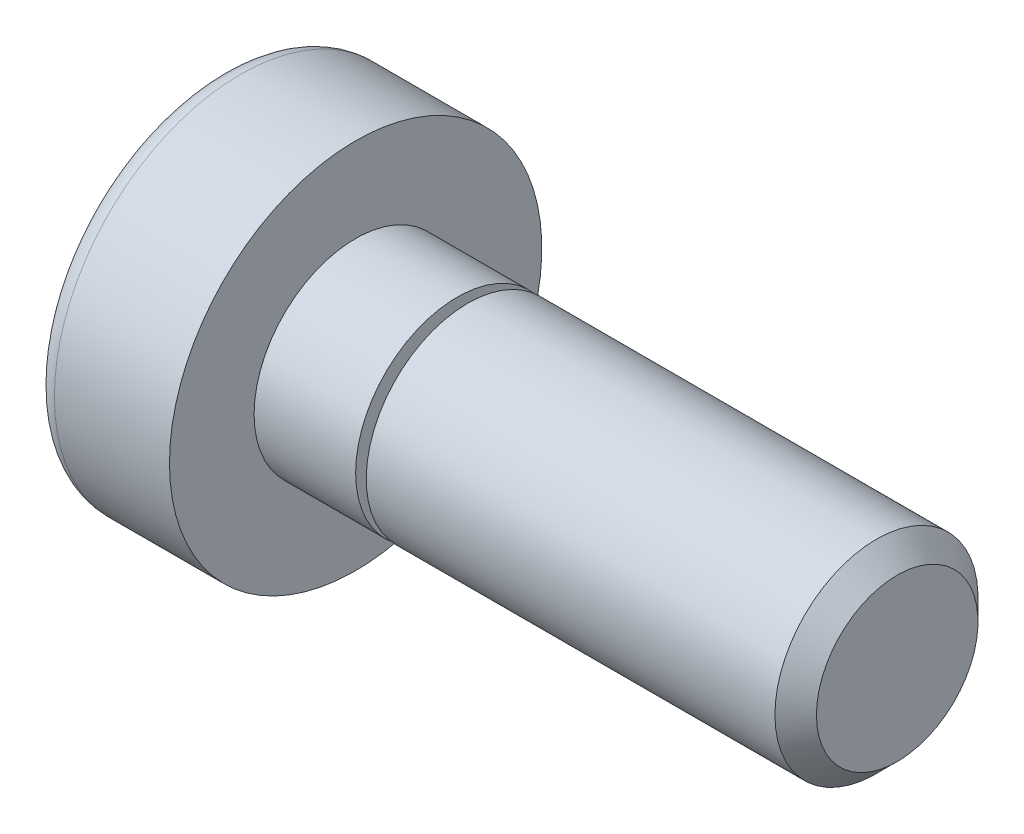
ISO-10303-21;
HEADER;
FILE_DESCRIPTION(('STEP AP214'),'2;1');
FILE_NAME('part.step','',(''),(''),'','','');
FILE_SCHEMA(('AUTOMOTIVE_DESIGN { 1 0 10303 214 1 1 1 1 }'));
ENDSEC;
DATA;
#1=APPLICATION_CONTEXT('core data for automotive mechanical design processes');
#2=APPLICATION_PROTOCOL_DEFINITION('international standard','automotive_design',2000,#1);
#3=PRODUCT_CONTEXT('',#1,'mechanical');
#4=PRODUCT('Part','Part','',(#3));
#5=PRODUCT_RELATED_PRODUCT_CATEGORY('part','',(#4));
#6=PRODUCT_DEFINITION_FORMATION('','',#4);
#7=PRODUCT_DEFINITION_CONTEXT('part definition',#1,'design');
#8=PRODUCT_DEFINITION('design','',#6,#7);
#9=PRODUCT_DEFINITION_SHAPE('','',#8);
#10=(LENGTH_UNIT() NAMED_UNIT(*) SI_UNIT(.MILLI.,.METRE.));
#11=(NAMED_UNIT(*) PLANE_ANGLE_UNIT() SI_UNIT($,.RADIAN.));
#12=(NAMED_UNIT(*) SI_UNIT($,.STERADIAN.) SOLID_ANGLE_UNIT());
#13=UNCERTAINTY_MEASURE_WITH_UNIT(LENGTH_MEASURE(1.E-05),#10,'distance_accuracy_value','');
#14=(GEOMETRIC_REPRESENTATION_CONTEXT(3) GLOBAL_UNCERTAINTY_ASSIGNED_CONTEXT((#13)) GLOBAL_UNIT_ASSIGNED_CONTEXT((#10,
#11,#12)) REPRESENTATION_CONTEXT('',''));
#15=CARTESIAN_POINT('',(0.,0.,0.));
#16=DIRECTION('',(0.,0.,1.));
#17=DIRECTION('',(1.,0.,0.));
#18=AXIS2_PLACEMENT_3D('',#15,#16,#17);
#19=CARTESIAN_POINT('',(8.00000000000001,0.596637499999982,0.));
#20=DIRECTION('',(1.,0.,0.));
#21=DIRECTION('',(0.,0.,-1.));
#22=AXIS2_PLACEMENT_3D('',#19,#20,#21);
#23=PLANE('',#22);
#24=CARTESIAN_POINT('',(8.00000000015189,0.,0.));
#25=DIRECTION('',(-1.,0.,0.));
#26=DIRECTION('',(0.,0.,1.));
#27=AXIS2_PLACEMENT_3D('',#24,#25,#26);
#28=CIRCLE('',#27,1.193275000162);
#29=CARTESIAN_POINT('',(8.00000000015189,0.,1.193275000162));
#30=VERTEX_POINT('',#29);
#31=EDGE_CURVE('E21',#30,#30,#28,.T.);
#32=ORIENTED_EDGE('',*,*,#31,.F.);
#33=EDGE_LOOP('',(#32));
#34=FACE_BOUND('',#33,.T.);
#35=ADVANCED_FACE('F17',(#34),#23,.T.);
#36=CARTESIAN_POINT('',(-0.504001038052593,0.,0.));
#37=DIRECTION('',(-1.,0.,0.));
#38=DIRECTION('',(0.,0.,1.));
#39=AXIS2_PLACEMENT_3D('',#36,#37,#38);
#40=CONICAL_SURFACE('',#39,1.16192999956868,1.04719754997475);
#41=CARTESIAN_POINT('',(-0.50000000075029,1.00000000017093,0.577948959467397));
#42=CARTESIAN_POINT('',(-0.48629237382386,1.00000000006138,0.530505986138768));
#43=CARTESIAN_POINT('',(-0.473741747990582,1.00000000001644,0.482687327239862));
#44=CARTESIAN_POINT('',(-0.451558908349822,0.999999999983497,0.386271956554048));
#45=CARTESIAN_POINT('',(-0.44193324759536,0.999999999995618,0.337673750815842));
#46=CARTESIAN_POINT('',(-0.426453805314798,1.00000000000426,0.241023607051425));
#47=CARTESIAN_POINT('',(-0.420517364499986,1.00000000000113,0.192985324559301));
#48=CARTESIAN_POINT('',(-0.412547942401927,0.999999999998846,0.0966311212845586));
#49=CARTESIAN_POINT('',(-0.41051070894798,0.999999999999682,0.0483155606396564));
#50=CARTESIAN_POINT('',(-0.410510708947904,1.00000000000029,-0.0483155606516336));
#51=CARTESIAN_POINT('',(-0.412547942401888,1.00000000000007,-0.0966311212980216));
#52=CARTESIAN_POINT('',(-0.42051736450243,0.999999999999905,-0.192985324574892));
#53=CARTESIAN_POINT('',(-0.42645380531968,0.999999999999964,-0.241023607067658));
#54=CARTESIAN_POINT('',(-0.441933247596229,1.00000000000001,-0.337673750835855));
#55=CARTESIAN_POINT('',(-0.451558908344039,1.,-0.386271956577252));
#56=CARTESIAN_POINT('',(-0.473741748006515,0.999999999999976,-0.482687327260879));
#57=CARTESIAN_POINT('',(-0.486292373868118,0.999999999999964,-0.530505986154419));
#58=CARTESIAN_POINT('',(-0.500000000862228,0.999999999999988,-0.577948959467407));
#59=B_SPLINE_CURVE_WITH_KNOTS('',3,(#41,#42,#43,#44,#45,#46,#47,#48,#49,#50,#51,#52,#53,#54,#55,
#56,#57,#58),.UNSPECIFIED.,.F.,.F.,(4,2,2,2,2,2,2,2,4),(0.,0.148196356176735,0.296722322329047,
0.44178762553006,0.586694641515675,0.731601657505277,0.876666960709908,1.02519292686637,
1.17338928304892),.UNSPECIFIED.);
#60=CARTESIAN_POINT('',(-0.500000000889303,0.9999999998933,0.577948959745722));
#61=VERTEX_POINT('',#60);
#62=CARTESIAN_POINT('',(-0.500000000853678,0.999999999893292,-0.577948959622423));
#63=VERTEX_POINT('',#62);
#64=EDGE_CURVE('E89',#61,#63,#59,.T.);
#65=ORIENTED_EDGE('',*,*,#64,.T.);
#66=CARTESIAN_POINT('',(-0.500000000750464,0.999999999897836,-0.577948959940425));
#67=CARTESIAN_POINT('',(-0.485349172417987,0.956037643373577,-0.603317483381026));
#68=CARTESIAN_POINT('',(-0.472026094856608,0.911695794901883,-0.628904993119268));
#69=CARTESIAN_POINT('',(-0.448773550966531,0.822244705373564,-0.680522837350934));
#70=CARTESIAN_POINT('',(-0.438852305303098,0.777133878102894,-0.706554087170983));
#71=CARTESIAN_POINT('',(-0.423412574947941,0.687471128207105,-0.758294070285883));
#72=CARTESIAN_POINT('',(-0.417791260614098,0.642932979666769,-0.783994855231221));
#73=CARTESIAN_POINT('',(-0.411087723114958,0.55364773953878,-0.835516995929307));
#74=CARTESIAN_POINT('',(-0.409999941275023,0.508900971214076,-0.86133816514283));
#75=CARTESIAN_POINT('',(-0.41229591450611,0.425330610917059,-0.909562528492407));
#76=CARTESIAN_POINT('',(-0.415115940411406,0.386494336443703,-0.931973041079041));
#77=CARTESIAN_POINT('',(-0.424043518593614,0.309074734851168,-0.976648102718697));
#78=CARTESIAN_POINT('',(-0.430154103428242,0.270491674344854,-0.998912497922489));
#79=CARTESIAN_POINT('',(-0.445426060622693,0.19291320262915,-1.04367923573219));
#80=CARTESIAN_POINT('',(-0.454651995831515,0.153927580990878,-1.06617592925591));
#81=CARTESIAN_POINT('',(-0.475589692626233,0.0765368941895256,-1.11083430558536));
#82=CARTESIAN_POINT('',(-0.487296553168151,0.0381308420256304,-1.13299655794095));
#83=CARTESIAN_POINT('',(-0.500000000861591,1.89814787464045E-10,-1.15499999989045));
#84=B_SPLINE_CURVE_WITH_KNOTS('',3,(#66,#67,#68,#69,#70,#71,#72,#73,#74,#75,#76,#77,#78,#79,#80,
#81,#82,#83),.UNSPECIFIED.,.F.,.F.,(4,2,2,2,2,2,2,2,4),(0.,0.158549163495099,0.317478810929082,
0.472477440453193,0.627285966368247,0.761939339569063,0.896717021353835,1.0344793450277,
1.17197201605907),.UNSPECIFIED.);
#85=CARTESIAN_POINT('',(-0.500000000853747,0.,-1.15499999987687));
#86=VERTEX_POINT('',#85);
#87=EDGE_CURVE('E117',#63,#86,#84,.T.);
#88=ORIENTED_EDGE('',*,*,#87,.T.);
#89=CARTESIAN_POINT('',(-0.500000000750449,-2.73026198863905E-10,-1.15500000003979));
#90=CARTESIAN_POINT('',(-0.485349172417975,-0.043962356687794,-1.12963147640945));
#91=CARTESIAN_POINT('',(-0.472026094856597,-0.0883042051145717,-1.10404396659337));
#92=CARTESIAN_POINT('',(-0.448773550966522,-0.177755294609957,-1.05242612230464));
#93=CARTESIAN_POINT('',(-0.43885230530309,-0.222866121892747,-1.02639487250559));
#94=CARTESIAN_POINT('',(-0.423412574947934,-0.312528871797154,-0.974654889405634));
#95=CARTESIAN_POINT('',(-0.41779126061409,-0.357067020334369,-0.948954104454888));
#96=CARTESIAN_POINT('',(-0.411087723114951,-0.446352260460088,-0.897431963752873));
#97=CARTESIAN_POINT('',(-0.409999941275016,-0.49109902878564,-0.871610794540822));
#98=CARTESIAN_POINT('',(-0.412295914506104,-0.574669389083187,-0.823386431192165));
#99=CARTESIAN_POINT('',(-0.4151159404114,-0.613505663556364,-0.800975918605219));
#100=CARTESIAN_POINT('',(-0.424043518593608,-0.690925265148767,-0.756300856965331));
#101=CARTESIAN_POINT('',(-0.430154103428237,-0.729508325655129,-0.73403646176162));
#102=CARTESIAN_POINT('',(-0.445426060622688,-0.807086797370873,-0.689269723951982));
#103=CARTESIAN_POINT('',(-0.454651995831512,-0.846072419009135,-0.666773030428251));
#104=CARTESIAN_POINT('',(-0.47558969262623,-0.923463105810469,-0.622114654098761));
#105=CARTESIAN_POINT('',(-0.487296553168149,-0.961869157974355,-0.599952401743155));
#106=CARTESIAN_POINT('',(-0.500000000861589,-0.999999999810191,-0.57794895979369));
#107=B_SPLINE_CURVE_WITH_KNOTS('',3,(#89,#90,#91,#92,#93,#94,#95,#96,#97,#98,#99,#100,#101,#102,
#103,#104,#105,#106),.UNSPECIFIED.,.F.,.F.,(4,2,2,2,2,2,2,2,4),(0.,0.158549163495095,
0.317478810929075,0.472477440453182,0.627285966368233,0.761939339569052,0.896717021353825,
1.03447934502769,1.17197201605906),.UNSPECIFIED.);
#108=CARTESIAN_POINT('',(-0.50000000085366,-0.99999999989333,-0.577948959622392));
#109=VERTEX_POINT('',#108);
#110=EDGE_CURVE('E147',#86,#109,#107,.T.);
#111=ORIENTED_EDGE('',*,*,#110,.T.);
#112=CARTESIAN_POINT('',(-0.500000000750238,-1.00000000017095,-0.577948959467375));
#113=CARTESIAN_POINT('',(-0.486292373823819,-1.00000000006139,-0.530505986138745));
#114=CARTESIAN_POINT('',(-0.473741747990546,-1.00000000001644,-0.48268732723984));
#115=CARTESIAN_POINT('',(-0.45155890834979,-0.999999999983495,-0.386271956554031));
#116=CARTESIAN_POINT('',(-0.441933247595326,-0.999999999995617,-0.337673750815828));
#117=CARTESIAN_POINT('',(-0.426453805314764,-1.00000000000426,-0.241023607051415));
#118=CARTESIAN_POINT('',(-0.420517364499953,-1.00000000000113,-0.192985324559293));
#119=CARTESIAN_POINT('',(-0.412547942401894,-0.999999999998846,-0.0966311212845551));
#120=CARTESIAN_POINT('',(-0.410510708947947,-0.999999999999682,-0.0483155606396551));
#121=CARTESIAN_POINT('',(-0.410510708947871,-1.00000000000029,0.0483155606516283));
#122=CARTESIAN_POINT('',(-0.412547942401855,-1.00000000000007,0.0966311212980118));
#123=CARTESIAN_POINT('',(-0.420517364502396,-0.999999999999905,0.192985324574873));
#124=CARTESIAN_POINT('',(-0.426453805319645,-0.999999999999964,0.241023607067635));
#125=CARTESIAN_POINT('',(-0.441933247596193,-1.00000000000001,0.337673750835823));
#126=CARTESIAN_POINT('',(-0.451558908344001,-1.,0.386271956577215));
#127=CARTESIAN_POINT('',(-0.473741748006474,-0.999999999999976,0.482687327260833));
#128=CARTESIAN_POINT('',(-0.486292373868075,-0.999999999999964,0.530505986154369));
#129=CARTESIAN_POINT('',(-0.500000000862184,-0.999999999999988,0.577948959467352));
#130=B_SPLINE_CURVE_WITH_KNOTS('',3,(#112,#113,#114,#115,#116,#117,#118,#119,#120,#121,#122,
#123,#124,#125,#126,#127,#128,#129),.UNSPECIFIED.,.F.,.F.,(4,2,2,2,2,2,2,2,4),(0.,
0.148196356176728,0.296722322329032,0.441787625530039,0.586694641515648,0.731601657505236,
0.876666960709854,1.0251929268663,1.17338928304884),.UNSPECIFIED.);
#131=CARTESIAN_POINT('',(-0.500000000853652,-0.999999999893325,0.577948959622376));
#132=VERTEX_POINT('',#131);
#133=EDGE_CURVE('E142',#109,#132,#130,.T.);
#134=ORIENTED_EDGE('',*,*,#133,.T.);
#135=CARTESIAN_POINT('',(-0.500000000750473,-0.999999999897884,0.577948959940368));
#136=CARTESIAN_POINT('',(-0.485349172417985,-0.956037643373636,0.603317483380982));
#137=CARTESIAN_POINT('',(-0.4720260948566,-0.911695794901945,0.628904993119229));
#138=CARTESIAN_POINT('',(-0.448773550966519,-0.822244705373628,0.6805228373509));
#139=CARTESIAN_POINT('',(-0.438852305303086,-0.777133878102956,0.706554087170948));
#140=CARTESIAN_POINT('',(-0.423412574947928,-0.687471128207166,0.758294070285848));
#141=CARTESIAN_POINT('',(-0.417791260614084,-0.642932979666829,0.783994855231186));
#142=CARTESIAN_POINT('',(-0.411087723114942,-0.55364773953884,0.835516995929273));
#143=CARTESIAN_POINT('',(-0.409999941275006,-0.508900971214135,0.861338165142796));
#144=CARTESIAN_POINT('',(-0.412295914506093,-0.425330610917115,0.909562528492374));
#145=CARTESIAN_POINT('',(-0.415115940411389,-0.386494336443757,0.931973041079009));
#146=CARTESIAN_POINT('',(-0.424043518593597,-0.309074734851218,0.976648102718668));
#147=CARTESIAN_POINT('',(-0.430154103428226,-0.270491674344901,0.998912497922462));
#148=CARTESIAN_POINT('',(-0.445426060622677,-0.192913202629193,1.04367923573217));
#149=CARTESIAN_POINT('',(-0.454651995831501,-0.153927580990918,1.06617592925588));
#150=CARTESIAN_POINT('',(-0.475589692626221,-0.0765368941895602,1.11083430558534));
#151=CARTESIAN_POINT('',(-0.48729655316814,-0.0381308420256624,1.13299655794093));
#152=CARTESIAN_POINT('',(-0.500000000861581,-1.89844400923488E-10,1.15499999989043));
#153=B_SPLINE_CURVE_WITH_KNOTS('',3,(#135,#136,#137,#138,#139,#140,#141,#142,#143,#144,#145,
#146,#147,#148,#149,#150,#151,#152),.UNSPECIFIED.,.F.,.F.,(4,2,2,2,2,2,2,2,4),(0.,
0.158549163495102,0.317478810929088,0.4724774404532,0.627285966368255,0.76193933956908,
0.896717021353859,1.03447934502773,1.17197201605911),.UNSPECIFIED.);
#154=CARTESIAN_POINT('',(-0.500000000853747,0.,1.15499999987686));
#155=VERTEX_POINT('',#154);
#156=EDGE_CURVE('E92',#132,#155,#153,.T.);
#157=ORIENTED_EDGE('',*,*,#156,.T.);
#158=CARTESIAN_POINT('',(-0.500000000750466,2.72993235255291E-10,1.1550000000398));
#159=CARTESIAN_POINT('',(-0.485349172417988,0.0439623566877654,1.12963147640946));
#160=CARTESIAN_POINT('',(-0.472026094856608,0.0883042051145458,1.10404396659338));
#161=CARTESIAN_POINT('',(-0.448773550966532,0.177755294609934,1.05242612230465));
#162=CARTESIAN_POINT('',(-0.438852305303101,0.222866121892726,1.02639487250561));
#163=CARTESIAN_POINT('',(-0.423412574947947,0.312528871797135,0.974654889405645));
#164=CARTESIAN_POINT('',(-0.417791260614104,0.357067020334351,0.948954104454898));
#165=CARTESIAN_POINT('',(-0.411087723114966,0.446352260460072,0.897431963752882));
#166=CARTESIAN_POINT('',(-0.409999941275032,0.491099028785625,0.87161079454083));
#167=CARTESIAN_POINT('',(-0.412295914506122,0.574669389083171,0.823386431192175));
#168=CARTESIAN_POINT('',(-0.415115940411418,0.613505663556343,0.800975918605231));
#169=CARTESIAN_POINT('',(-0.424043518593627,0.690925265148738,0.756300856965347));
#170=CARTESIAN_POINT('',(-0.430154103428255,0.729508325655096,0.734036461761639));
#171=CARTESIAN_POINT('',(-0.445426060622704,0.807086797370832,0.689269723952005));
#172=CARTESIAN_POINT('',(-0.454651995831527,0.846072419009092,0.666773030428277));
#173=CARTESIAN_POINT('',(-0.475589692626243,0.923463105810418,0.622114654098791));
#174=CARTESIAN_POINT('',(-0.48729655316816,0.961869157974301,0.599952401743187));
#175=CARTESIAN_POINT('',(-0.500000000861598,0.999999999810133,0.577948959793723));
#176=B_SPLINE_CURVE_WITH_KNOTS('',3,(#158,#159,#160,#161,#162,#163,#164,#165,#166,#167,#168,
#169,#170,#171,#172,#173,#174,#175),.UNSPECIFIED.,.F.,.F.,(4,2,2,2,2,2,2,2,4),(0.,
0.1585491634951,0.317478810929084,0.472477440453195,0.627285966368249,0.761939339569055,
0.896717021353815,1.03447934502767,1.17197201605903),.UNSPECIFIED.);
#177=EDGE_CURVE('E62',#155,#61,#176,.T.);
#178=ORIENTED_EDGE('',*,*,#177,.T.);
#179=EDGE_LOOP('',(#65,#88,#111,#134,#157,#178));
#180=FACE_BOUND('',#179,.T.);
#181=CARTESIAN_POINT('',(0.166839561870802,-1.13686837721616E-10,0.));
#182=VERTEX_POINT('',#181);
#183=VERTEX_LOOP('',#182);
#184=FACE_BOUND('',#183,.T.);
#185=ADVANCED_FACE('F86',(#180,#184),#40,.F.);
#186=CARTESIAN_POINT('',(7.69327499995143,0.,0.));
#187=DIRECTION('',(-1.,0.,0.));
#188=DIRECTION('',(0.,0.,1.));
#189=AXIS2_PLACEMENT_3D('',#186,#187,#188);
#190=CONICAL_SURFACE('',#189,1.49999999979403,0.78539816247083);
#191=CARTESIAN_POINT('',(7.6932750000001,0.,0.));
#192=DIRECTION('',(-1.,0.,0.));
#193=DIRECTION('',(0.,1.,0.));
#194=AXIS2_PLACEMENT_3D('',#191,#192,#193);
#195=CIRCLE('',#194,1.49999999999999);
#196=CARTESIAN_POINT('',(7.6932750000001,1.49999999999997,0.));
#197=VERTEX_POINT('',#196);
#198=EDGE_CURVE('E104',#197,#197,#195,.T.);
#199=ORIENTED_EDGE('',*,*,#198,.F.);
#200=EDGE_LOOP('',(#199));
#201=FACE_BOUND('',#200,.T.);
#202=ORIENTED_EDGE('',*,*,#31,.T.);
#203=EDGE_LOOP('',(#202));
#204=FACE_BOUND('',#203,.T.);
#205=ADVANCED_FACE('F129',(#201,#204),#190,.T.);
#206=CARTESIAN_POINT('',(-2.,0.,1.155));
#207=DIRECTION('',(0.,0.499805607369879,0.86613760733594));
#208=DIRECTION('',(0.,-0.86613760733594,0.499805607369879));
#209=AXIS2_PLACEMENT_3D('',#206,#207,#208);
#210=PLANE('',#209);
#211=DIRECTION('',(1.,0.,0.));
#212=VECTOR('',#211,1.);
#213=CARTESIAN_POINT('',(-2.,0.,1.15500000000001));
#214=LINE('',#213,#212);
#215=CARTESIAN_POINT('',(-2.,0.,1.155));
#216=VERTEX_POINT('',#215);
#217=EDGE_CURVE('E94',#155,#216,#214,.F.);
#218=ORIENTED_EDGE('',*,*,#217,.T.);
#219=DIRECTION('',(0.,-0.866137607335932,0.499805607369892));
#220=VECTOR('',#219,1.);
#221=CARTESIAN_POINT('',(-2.,0.999999999999988,0.577948959684148));
#222=LINE('',#221,#220);
#223=CARTESIAN_POINT('',(-2.,0.999999999999988,0.577948959684148));
#224=VERTEX_POINT('',#223);
#225=EDGE_CURVE('E83',#224,#216,#222,.T.);
#226=ORIENTED_EDGE('',*,*,#225,.F.);
#227=DIRECTION('',(1.,0.,0.));
#228=VECTOR('',#227,1.);
#229=CARTESIAN_POINT('',(-2.,0.999999999999988,0.577948959684148));
#230=LINE('',#229,#228);
#231=EDGE_CURVE('E95',#224,#61,#230,.T.);
#232=ORIENTED_EDGE('',*,*,#231,.T.);
#233=ORIENTED_EDGE('',*,*,#177,.F.);
#234=EDGE_LOOP('',(#218,#226,#232,#233));
#235=FACE_BOUND('',#234,.T.);
#236=ADVANCED_FACE('F96',(#235),#210,.F.);
#237=CARTESIAN_POINT('',(-2.,-0.999999999999988,0.577948959684148));
#238=DIRECTION('',(0.,-0.499805607369879,0.86613760733594));
#239=DIRECTION('',(0.,-0.86613760733594,-0.499805607369879));
#240=AXIS2_PLACEMENT_3D('',#237,#238,#239);
#241=PLANE('',#240);
#242=DIRECTION('',(1.,0.,0.));
#243=VECTOR('',#242,1.);
#244=CARTESIAN_POINT('',(-2.,-0.999999999999988,0.577948959684097));
#245=LINE('',#244,#243);
#246=CARTESIAN_POINT('',(-2.,-0.999999999999988,0.577948959684116));
#247=VERTEX_POINT('',#246);
#248=EDGE_CURVE('E265',#132,#247,#245,.F.);
#249=ORIENTED_EDGE('',*,*,#248,.T.);
#250=DIRECTION('',(0.,-0.866137607335932,-0.499805607369892));
#251=VECTOR('',#250,1.);
#252=CARTESIAN_POINT('',(-2.,0.,1.155));
#253=LINE('',#252,#251);
#254=EDGE_CURVE('E228',#216,#247,#253,.T.);
#255=ORIENTED_EDGE('',*,*,#254,.F.);
#256=ORIENTED_EDGE('',*,*,#217,.F.);
#257=ORIENTED_EDGE('',*,*,#156,.F.);
#258=EDGE_LOOP('',(#249,#255,#256,#257));
#259=FACE_BOUND('',#258,.T.);
#260=ADVANCED_FACE('F263',(#259),#241,.F.);
#261=CARTESIAN_POINT('',(-2.,-0.999999999999988,-0.577948959684148));
#262=DIRECTION('',(0.,-1.,0.));
#263=DIRECTION('',(0.,0.,-1.));
#264=AXIS2_PLACEMENT_3D('',#261,#262,#263);
#265=PLANE('',#264);
#266=DIRECTION('',(1.,0.,0.));
#267=VECTOR('',#266,1.);
#268=CARTESIAN_POINT('',(-2.,-1.00000000000008,-0.577948959684112));
#269=LINE('',#268,#267);
#270=CARTESIAN_POINT('',(-2.,-1.00000000000005,-0.577948959684124));
#271=VERTEX_POINT('',#270);
#272=EDGE_CURVE('E154',#109,#271,#269,.F.);
#273=ORIENTED_EDGE('',*,*,#272,.T.);
#274=DIRECTION('',(0.,0.,1.));
#275=VECTOR('',#274,1.);
#276=CARTESIAN_POINT('',(-2.,-0.999999999999988,0.));
#277=LINE('',#276,#275);
#278=EDGE_CURVE('E242',#247,#271,#277,.F.);
#279=ORIENTED_EDGE('',*,*,#278,.F.);
#280=ORIENTED_EDGE('',*,*,#248,.F.);
#281=ORIENTED_EDGE('',*,*,#133,.F.);
#282=EDGE_LOOP('',(#273,#279,#280,#281));
#283=FACE_BOUND('',#282,.T.);
#284=ADVANCED_FACE('F159',(#283),#265,.F.);
#285=CARTESIAN_POINT('',(-2.,0.,-1.155));
#286=DIRECTION('',(0.,-0.499805607369879,-0.86613760733594));
#287=DIRECTION('',(0.,0.86613760733594,-0.499805607369879));
#288=AXIS2_PLACEMENT_3D('',#285,#286,#287);
#289=PLANE('',#288);
#290=DIRECTION('',(1.,0.,0.));
#291=VECTOR('',#290,1.);
#292=CARTESIAN_POINT('',(-2.,0.,-1.15500000000002));
#293=LINE('',#292,#291);
#294=CARTESIAN_POINT('',(-2.,0.,-1.15500000000001));
#295=VERTEX_POINT('',#294);
#296=EDGE_CURVE('E153',#86,#295,#293,.F.);
#297=ORIENTED_EDGE('',*,*,#296,.T.);
#298=DIRECTION('',(0.,0.866137607335932,-0.499805607369892));
#299=VECTOR('',#298,1.);
#300=CARTESIAN_POINT('',(-2.,-0.999999999999988,-0.577948959684148));
#301=LINE('',#300,#299);
#302=EDGE_CURVE('E237',#271,#295,#301,.T.);
#303=ORIENTED_EDGE('',*,*,#302,.F.);
#304=ORIENTED_EDGE('',*,*,#272,.F.);
#305=ORIENTED_EDGE('',*,*,#110,.F.);
#306=EDGE_LOOP('',(#297,#303,#304,#305));
#307=FACE_BOUND('',#306,.T.);
#308=ADVANCED_FACE('F155',(#307),#289,.F.);
#309=CARTESIAN_POINT('',(-2.,0.999999999999988,-0.577948959684148));
#310=DIRECTION('',(0.,0.499805607369879,-0.86613760733594));
#311=DIRECTION('',(0.,0.86613760733594,0.499805607369879));
#312=AXIS2_PLACEMENT_3D('',#309,#310,#311);
#313=PLANE('',#312);
#314=DIRECTION('',(1.,0.,0.));
#315=VECTOR('',#314,1.);
#316=CARTESIAN_POINT('',(-2.,0.999999999999988,-0.577948959684173));
#317=LINE('',#316,#315);
#318=CARTESIAN_POINT('',(-2.,0.999999999999988,-0.577948959684164));
#319=VERTEX_POINT('',#318);
#320=EDGE_CURVE('E100',#63,#319,#317,.F.);
#321=ORIENTED_EDGE('',*,*,#320,.T.);
#322=DIRECTION('',(0.,0.866137607335932,0.499805607369892));
#323=VECTOR('',#322,1.);
#324=CARTESIAN_POINT('',(-2.,0.,-1.155));
#325=LINE('',#324,#323);
#326=EDGE_CURVE('E232',#295,#319,#325,.T.);
#327=ORIENTED_EDGE('',*,*,#326,.F.);
#328=ORIENTED_EDGE('',*,*,#296,.F.);
#329=ORIENTED_EDGE('',*,*,#87,.F.);
#330=EDGE_LOOP('',(#321,#327,#328,#329));
#331=FACE_BOUND('',#330,.T.);
#332=ADVANCED_FACE('F158',(#331),#313,.F.);
#333=CARTESIAN_POINT('',(-2.,0.999999999999988,0.577948959684148));
#334=DIRECTION('',(0.,1.,0.));
#335=DIRECTION('',(0.,0.,1.));
#336=AXIS2_PLACEMENT_3D('',#333,#334,#335);
#337=PLANE('',#336);
#338=ORIENTED_EDGE('',*,*,#231,.F.);
#339=DIRECTION('',(0.,0.,1.));
#340=VECTOR('',#339,1.);
#341=CARTESIAN_POINT('',(-2.,0.999999999999988,0.));
#342=LINE('',#341,#340);
#343=EDGE_CURVE('E225',#319,#224,#342,.T.);
#344=ORIENTED_EDGE('',*,*,#343,.F.);
#345=ORIENTED_EDGE('',*,*,#320,.F.);
#346=ORIENTED_EDGE('',*,*,#64,.F.);
#347=EDGE_LOOP('',(#338,#344,#345,#346));
#348=FACE_BOUND('',#347,.T.);
#349=ADVANCED_FACE('F103',(#348),#337,.F.);
#350=CARTESIAN_POINT('',(7.6932750000001,0.,0.));
#351=DIRECTION('',(-1.,0.,0.));
#352=DIRECTION('',(0.,0.,1.));
#353=AXIS2_PLACEMENT_3D('',#350,#351,#352);
#354=CYLINDRICAL_SURFACE('',#353,1.49999999999999);
#355=CARTESIAN_POINT('',(1.65630773523162,0.,0.));
#356=DIRECTION('',(1.,0.,0.));
#357=DIRECTION('',(0.,1.,0.));
#358=AXIS2_PLACEMENT_3D('',#355,#356,#357);
#359=CIRCLE('',#358,1.49999999990769);
#360=CARTESIAN_POINT('',(1.65630773523162,1.49999999990769,0.));
#361=VERTEX_POINT('',#360);
#362=EDGE_CURVE('E214',#361,#361,#359,.F.);
#363=ORIENTED_EDGE('',*,*,#362,.F.);
#364=EDGE_LOOP('',(#363));
#365=FACE_BOUND('',#364,.T.);
#366=ORIENTED_EDGE('',*,*,#198,.T.);
#367=EDGE_LOOP('',(#366));
#368=FACE_BOUND('',#367,.T.);
#369=ADVANCED_FACE('F169',(#365,#368),#354,.T.);
#370=CARTESIAN_POINT('',(-2.,1.95250000000001,0.));
#371=DIRECTION('',(-1.,0.,0.));
#372=DIRECTION('',(0.,0.,1.));
#373=AXIS2_PLACEMENT_3D('',#370,#371,#372);
#374=PLANE('',#373);
#375=ORIENTED_EDGE('',*,*,#326,.T.);
#376=ORIENTED_EDGE('',*,*,#343,.T.);
#377=ORIENTED_EDGE('',*,*,#225,.T.);
#378=ORIENTED_EDGE('',*,*,#254,.T.);
#379=ORIENTED_EDGE('',*,*,#278,.T.);
#380=ORIENTED_EDGE('',*,*,#302,.T.);
#381=EDGE_LOOP('',(#375,#376,#377,#378,#379,#380));
#382=FACE_BOUND('',#381,.T.);
#383=CARTESIAN_POINT('',(-2.,0.,-2.44999999999998));
#384=CARTESIAN_POINT('',(-2.,-0.467309748428746,-2.44989883647268));
#385=CARTESIAN_POINT('',(-2.,-0.90183203842658,-2.27798133760294));
#386=CARTESIAN_POINT('',(-2.,-1.37316590275571,-2.09149944483633));
#387=CARTESIAN_POINT('',(-2.,-1.73241161390703,-1.73241161390703));
#388=CARTESIAN_POINT('',(-2.,-2.09091197099622,-1.37406880947389));
#389=CARTESIAN_POINT('',(-2.,-2.27798133760293,-0.901832038426582));
#390=CARTESIAN_POINT('',(-2.,-2.44989872063477,-0.467844842540371));
#391=CARTESIAN_POINT('',(-2.,-2.44999999999998,0.));
#392=CARTESIAN_POINT('',(-2.,-2.45010105288375,0.466798645495714));
#393=CARTESIAN_POINT('',(-2.,-2.27798133760294,0.901832038426581));
#394=CARTESIAN_POINT('',(-2.,-2.09149944483577,1.37316590275647));
#395=CARTESIAN_POINT('',(-2.,-1.73241161390703,1.73241161390703));
#396=CARTESIAN_POINT('',(-2.,-1.37406880947355,2.09091197099636));
#397=CARTESIAN_POINT('',(-2.,-0.901832038426582,2.27798133760293));
#398=CARTESIAN_POINT('',(-2.,-0.467844842539406,2.44989872063515));
#399=CARTESIAN_POINT('',(-2.,0.,2.44999999999998));
#400=B_SPLINE_CURVE_WITH_KNOTS('',2,(#383,#384,#385,#386,#387,#388,#389,#390,#391,#392,#393,
#394,#395,#396,#397,#398,#399),.UNSPECIFIED.,.F.,.F.,(3,2,2,2,2,2,2,2,3),(0.,0.125,0.25,0.375,
0.5,0.625,0.75,0.875,1.),.UNSPECIFIED.);
#401=CARTESIAN_POINT('',(-2.,0.,-2.44999999999998));
#402=VERTEX_POINT('',#401);
#403=CARTESIAN_POINT('',(-2.,0.,2.44999999999998));
#404=VERTEX_POINT('',#403);
#405=EDGE_CURVE('E36',#402,#404,#400,.T.);
#406=ORIENTED_EDGE('',*,*,#405,.T.);
#407=CARTESIAN_POINT('',(-2.,0.,2.44999999999998));
#408=CARTESIAN_POINT('',(-2.,0.467309748428887,2.44989883647287));
#409=CARTESIAN_POINT('',(-2.,0.90183203842658,2.27798133760294));
#410=CARTESIAN_POINT('',(-2.,1.37316590275599,2.09149944483595));
#411=CARTESIAN_POINT('',(-2.,1.73241161390703,1.73241161390703));
#412=CARTESIAN_POINT('',(-2.,2.09091197099582,1.3740688094744));
#413=CARTESIAN_POINT('',(-2.,2.27798133760294,0.901832038426581));
#414=CARTESIAN_POINT('',(-2.,2.44989872063534,0.467844842539397));
#415=CARTESIAN_POINT('',(-2.,2.44999999999998,0.));
#416=B_SPLINE_CURVE_WITH_KNOTS('',2,(#407,#408,#409,#410,#411,#412,#413,#414,#415),
.UNSPECIFIED.,.F.,.F.,(3,2,2,2,3),(0.,0.25,0.5,0.75,1.),.UNSPECIFIED.);
#417=CARTESIAN_POINT('',(-2.,2.44999999999998,0.));
#418=VERTEX_POINT('',#417);
#419=EDGE_CURVE('E206',#404,#418,#416,.T.);
#420=ORIENTED_EDGE('',*,*,#419,.T.);
#421=CARTESIAN_POINT('',(-2.,2.44999999999998,0.));
#422=CARTESIAN_POINT('',(-2.,2.44989883647287,-0.467309748428838));
#423=CARTESIAN_POINT('',(-2.,2.27798133760294,-0.901832038426581));
#424=CARTESIAN_POINT('',(-2.,2.09149944483599,-1.37316590275595));
#425=CARTESIAN_POINT('',(-2.,1.73241161390703,-1.73241161390703));
#426=CARTESIAN_POINT('',(-2.,1.37406880947477,-2.09091197099545));
#427=CARTESIAN_POINT('',(-2.,0.901832038426581,-2.27798133760294));
#428=CARTESIAN_POINT('',(-2.,0.467844842540398,-2.44989872063515));
#429=CARTESIAN_POINT('',(-2.,0.,-2.44999999999998));
#430=B_SPLINE_CURVE_WITH_KNOTS('',2,(#421,#422,#423,#424,#425,#426,#427,#428,#429),
.UNSPECIFIED.,.F.,.F.,(3,2,2,2,3),(0.,0.25,0.5,0.75,1.),.UNSPECIFIED.);
#431=EDGE_CURVE('E200',#418,#402,#430,.T.);
#432=ORIENTED_EDGE('',*,*,#431,.T.);
#433=EDGE_LOOP('',(#406,#420,#432));
#434=FACE_BOUND('',#433,.T.);
#435=ADVANCED_FACE('F192',(#382,#434),#374,.T.);
#436=CARTESIAN_POINT('',(1.65630773523162,0.,0.));
#437=DIRECTION('',(1.,0.,0.));
#438=DIRECTION('',(0.,0.,-1.));
#439=AXIS2_PLACEMENT_3D('',#436,#437,#438);
#440=CONICAL_SURFACE('',#439,1.49999999990769,1.0471975499748);
#441=CARTESIAN_POINT('',(1.49999999985084,0.,0.));
#442=DIRECTION('',(1.,0.,0.));
#443=DIRECTION('',(0.,0.,-1.));
#444=AXIS2_PLACEMENT_3D('',#441,#442,#443);
#445=CIRCLE('',#444,1.22926706137605);
#446=CARTESIAN_POINT('',(1.49999999985084,0.,-1.22926706137605));
#447=VERTEX_POINT('',#446);
#448=EDGE_CURVE('E115',#447,#447,#445,.T.);
#449=ORIENTED_EDGE('',*,*,#448,.T.);
#450=EDGE_LOOP('',(#449));
#451=FACE_BOUND('',#450,.T.);
#452=ORIENTED_EDGE('',*,*,#362,.T.);
#453=EDGE_LOOP('',(#452));
#454=FACE_BOUND('',#453,.T.);
#455=ADVANCED_FACE('F189',(#451,#454),#440,.T.);
#456=CARTESIAN_POINT('',(-1.69999999999998,0.,0.));
#457=DIRECTION('',(-1.,0.,0.));
#458=DIRECTION('',(0.,-1.,0.));
#459=AXIS2_PLACEMENT_3D('',#456,#457,#458);
#460=TOROIDAL_SURFACE('',#459,2.44999999999998,0.300000000000019);
#461=CARTESIAN_POINT('',(-1.69999999999998,0.,0.));
#462=DIRECTION('',(-1.,0.,0.));
#463=DIRECTION('',(0.,1.,0.));
#464=AXIS2_PLACEMENT_3D('',#461,#462,#463);
#465=CIRCLE('',#464,2.75000000000002);
#466=CARTESIAN_POINT('',(-1.69999999999998,2.75,0.));
#467=VERTEX_POINT('',#466);
#468=EDGE_CURVE('E215',#467,#467,#465,.F.);
#469=ORIENTED_EDGE('',*,*,#468,.F.);
#470=EDGE_LOOP('',(#469));
#471=FACE_BOUND('',#470,.T.);
#472=ORIENTED_EDGE('',*,*,#419,.F.);
#473=ORIENTED_EDGE('',*,*,#405,.F.);
#474=ORIENTED_EDGE('',*,*,#431,.F.);
#475=EDGE_LOOP('',(#472,#473,#474));
#476=FACE_BOUND('',#475,.T.);
#477=ADVANCED_FACE('F19',(#471,#476),#460,.T.);
#478=CARTESIAN_POINT('',(1.50000000000005,1.3646335306587,0.));
#479=DIRECTION('',(-1.,0.,0.));
#480=DIRECTION('',(0.,0.,1.));
#481=AXIS2_PLACEMENT_3D('',#478,#479,#480);
#482=PLANE('',#481);
#483=ORIENTED_EDGE('',*,*,#448,.F.);
#484=EDGE_LOOP('',(#483));
#485=FACE_BOUND('',#484,.T.);
#486=CARTESIAN_POINT('',(1.50000000000005,0.,0.));
#487=DIRECTION('',(-1.,0.,0.));
#488=DIRECTION('',(0.,0.,1.));
#489=AXIS2_PLACEMENT_3D('',#486,#487,#488);
#490=CIRCLE('',#489,1.49999999999999);
#491=CARTESIAN_POINT('',(1.50000000000005,0.,1.49999999999999));
#492=VERTEX_POINT('',#491);
#493=EDGE_CURVE('E223',#492,#492,#490,.T.);
#494=ORIENTED_EDGE('',*,*,#493,.F.);
#495=EDGE_LOOP('',(#494));
#496=FACE_BOUND('',#495,.T.);
#497=ADVANCED_FACE('F184',(#485,#496),#482,.F.);
#498=CARTESIAN_POINT('',(0.,0.,0.));
#499=DIRECTION('',(-1.,0.,0.));
#500=DIRECTION('',(0.,0.,1.));
#501=AXIS2_PLACEMENT_3D('',#498,#499,#500);
#502=CYLINDRICAL_SURFACE('',#501,2.75000000000002);
#503=ORIENTED_EDGE('',*,*,#468,.T.);
#504=EDGE_LOOP('',(#503));
#505=FACE_BOUND('',#504,.T.);
#506=CARTESIAN_POINT('',(0.,0.,0.));
#507=DIRECTION('',(-1.,0.,0.));
#508=DIRECTION('',(0.,0.,1.));
#509=AXIS2_PLACEMENT_3D('',#506,#507,#508);
#510=CIRCLE('',#509,2.75000000000002);
#511=CARTESIAN_POINT('',(0.,0.,2.75000000000002));
#512=VERTEX_POINT('',#511);
#513=EDGE_CURVE('E27',#512,#512,#510,.F.);
#514=ORIENTED_EDGE('',*,*,#513,.F.);
#515=EDGE_LOOP('',(#514));
#516=FACE_BOUND('',#515,.T.);
#517=ADVANCED_FACE('F177',(#505,#516),#502,.T.);
#518=CARTESIAN_POINT('',(1.50000000000005,0.,0.));
#519=DIRECTION('',(-1.,0.,0.));
#520=DIRECTION('',(0.,0.,1.));
#521=AXIS2_PLACEMENT_3D('',#518,#519,#520);
#522=CYLINDRICAL_SURFACE('',#521,1.49999999999999);
#523=CARTESIAN_POINT('',(0.,0.,0.));
#524=DIRECTION('',(-1.,0.,0.));
#525=DIRECTION('',(0.,0.,1.));
#526=AXIS2_PLACEMENT_3D('',#523,#524,#525);
#527=CIRCLE('',#526,1.49999999999999);
#528=CARTESIAN_POINT('',(0.,0.,1.49999999999999));
#529=VERTEX_POINT('',#528);
#530=EDGE_CURVE('E11',#529,#529,#527,.T.);
#531=ORIENTED_EDGE('',*,*,#530,.F.);
#532=EDGE_LOOP('',(#531));
#533=FACE_BOUND('',#532,.T.);
#534=ORIENTED_EDGE('',*,*,#493,.T.);
#535=EDGE_LOOP('',(#534));
#536=FACE_BOUND('',#535,.T.);
#537=ADVANCED_FACE('F172',(#533,#536),#522,.T.);
#538=CARTESIAN_POINT('',(0.,2.12499999999998,0.));
#539=DIRECTION('',(1.,0.,0.));
#540=DIRECTION('',(0.,0.,-1.));
#541=AXIS2_PLACEMENT_3D('',#538,#539,#540);
#542=PLANE('',#541);
#543=ORIENTED_EDGE('',*,*,#530,.T.);
#544=EDGE_LOOP('',(#543));
#545=FACE_BOUND('',#544,.T.);
#546=ORIENTED_EDGE('',*,*,#513,.T.);
#547=EDGE_LOOP('',(#546));
#548=FACE_BOUND('',#547,.T.);
#549=ADVANCED_FACE('F170',(#545,#548),#542,.T.);
#550=CLOSED_SHELL('',(#35,#185,#205,#236,#260,#284,#308,#332,#349,#369,#435,#455,#477,#497,#517,
#537,#549));
#551=MANIFOLD_SOLID_BREP('B1',#550);
#552=ADVANCED_BREP_SHAPE_REPRESENTATION('',(#18,#551),#14);
#553=SHAPE_DEFINITION_REPRESENTATION(#9,#552);
ENDSEC;
END-ISO-10303-21;
